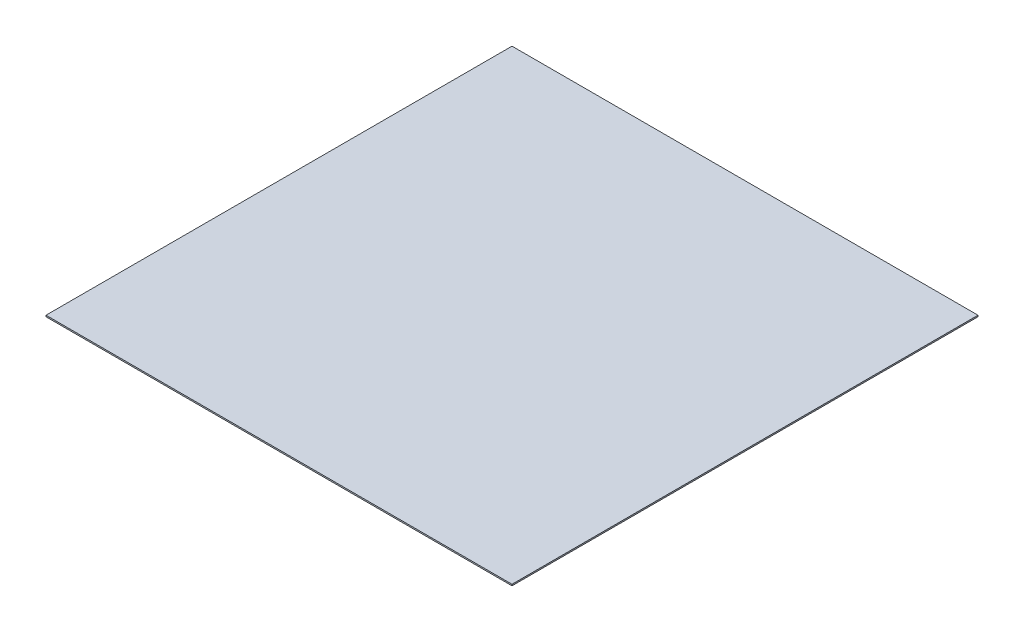
ISO-10303-21;
HEADER;
FILE_DESCRIPTION(('STEP AP214'),'2;1');
FILE_NAME('part.step','',(''),(''),'','','');
FILE_SCHEMA(('AUTOMOTIVE_DESIGN { 1 0 10303 214 1 1 1 1 }'));
ENDSEC;
DATA;
#1=APPLICATION_CONTEXT('core data for automotive mechanical design processes');
#2=APPLICATION_PROTOCOL_DEFINITION('international standard','automotive_design',2000,#1);
#3=PRODUCT_CONTEXT('',#1,'mechanical');
#4=PRODUCT('Part','Part','',(#3));
#5=PRODUCT_RELATED_PRODUCT_CATEGORY('part','',(#4));
#6=PRODUCT_DEFINITION_FORMATION('','',#4);
#7=PRODUCT_DEFINITION_CONTEXT('part definition',#1,'design');
#8=PRODUCT_DEFINITION('design','',#6,#7);
#9=PRODUCT_DEFINITION_SHAPE('','',#8);
#10=(LENGTH_UNIT() NAMED_UNIT(*) SI_UNIT(.MILLI.,.METRE.));
#11=(NAMED_UNIT(*) PLANE_ANGLE_UNIT() SI_UNIT($,.RADIAN.));
#12=(NAMED_UNIT(*) SI_UNIT($,.STERADIAN.) SOLID_ANGLE_UNIT());
#13=UNCERTAINTY_MEASURE_WITH_UNIT(LENGTH_MEASURE(1.E-05),#10,'distance_accuracy_value','');
#14=(GEOMETRIC_REPRESENTATION_CONTEXT(3) GLOBAL_UNCERTAINTY_ASSIGNED_CONTEXT((#13)) GLOBAL_UNIT_ASSIGNED_CONTEXT((#10,
#11,#12)) REPRESENTATION_CONTEXT('',''));
#15=CARTESIAN_POINT('',(0.,0.,0.));
#16=DIRECTION('',(0.,0.,1.));
#17=DIRECTION('',(1.,0.,0.));
#18=AXIS2_PLACEMENT_3D('',#15,#16,#17);
#19=CARTESIAN_POINT('',(0.,3.,0.));
#20=DIRECTION('',(1.,0.,0.));
#21=DIRECTION('',(0.,0.,-1.));
#22=AXIS2_PLACEMENT_3D('',#19,#20,#21);
#23=PLANE('',#22);
#24=DIRECTION('',(0.,0.,1.));
#25=VECTOR('',#24,1.);
#26=CARTESIAN_POINT('',(0.,0.,0.));
#27=LINE('',#26,#25);
#28=CARTESIAN_POINT('',(0.,0.,-1000.));
#29=VERTEX_POINT('',#28);
#30=CARTESIAN_POINT('',(0.,0.,0.));
#31=VERTEX_POINT('',#30);
#32=EDGE_CURVE('E96',#29,#31,#27,.T.);
#33=ORIENTED_EDGE('',*,*,#32,.T.);
#34=DIRECTION('',(0.,-1.,0.));
#35=VECTOR('',#34,1.);
#36=CARTESIAN_POINT('',(0.,3.,0.));
#37=LINE('',#36,#35);
#38=CARTESIAN_POINT('',(0.,3.,0.));
#39=VERTEX_POINT('',#38);
#40=EDGE_CURVE('E11',#39,#31,#37,.T.);
#41=ORIENTED_EDGE('',*,*,#40,.F.);
#42=DIRECTION('',(0.,0.,1.));
#43=VECTOR('',#42,1.);
#44=CARTESIAN_POINT('',(0.,3.,0.));
#45=LINE('',#44,#43);
#46=CARTESIAN_POINT('',(0.,3.,-1000.));
#47=VERTEX_POINT('',#46);
#48=EDGE_CURVE('E84',#47,#39,#45,.T.);
#49=ORIENTED_EDGE('',*,*,#48,.F.);
#50=DIRECTION('',(0.,-1.,0.));
#51=VECTOR('',#50,1.);
#52=CARTESIAN_POINT('',(0.,3.,-1000.));
#53=LINE('',#52,#51);
#54=EDGE_CURVE('E92',#47,#29,#53,.T.);
#55=ORIENTED_EDGE('',*,*,#54,.T.);
#56=EDGE_LOOP('',(#33,#41,#49,#55));
#57=FACE_BOUND('',#56,.T.);
#58=ADVANCED_FACE('F33',(#57),#23,.F.);
#59=CARTESIAN_POINT('',(0.,3.,0.));
#60=DIRECTION('',(0.,0.,-1.));
#61=DIRECTION('',(-1.,0.,0.));
#62=AXIS2_PLACEMENT_3D('',#59,#60,#61);
#63=PLANE('',#62);
#64=DIRECTION('',(1.,0.,0.));
#65=VECTOR('',#64,1.);
#66=CARTESIAN_POINT('',(0.,0.,0.));
#67=LINE('',#66,#65);
#68=CARTESIAN_POINT('',(1000.,0.,0.));
#69=VERTEX_POINT('',#68);
#70=EDGE_CURVE('E88',#31,#69,#67,.T.);
#71=ORIENTED_EDGE('',*,*,#70,.T.);
#72=DIRECTION('',(0.,-1.,0.));
#73=VECTOR('',#72,1.);
#74=CARTESIAN_POINT('',(1000.,3.,0.));
#75=LINE('',#74,#73);
#76=CARTESIAN_POINT('',(1000.,3.,0.));
#77=VERTEX_POINT('',#76);
#78=EDGE_CURVE('E41',#77,#69,#75,.T.);
#79=ORIENTED_EDGE('',*,*,#78,.F.);
#80=DIRECTION('',(1.,0.,0.));
#81=VECTOR('',#80,1.);
#82=CARTESIAN_POINT('',(0.,3.,0.));
#83=LINE('',#82,#81);
#84=EDGE_CURVE('E79',#39,#77,#83,.T.);
#85=ORIENTED_EDGE('',*,*,#84,.F.);
#86=ORIENTED_EDGE('',*,*,#40,.T.);
#87=EDGE_LOOP('',(#71,#79,#85,#86));
#88=FACE_BOUND('',#87,.T.);
#89=ADVANCED_FACE('F87',(#88),#63,.F.);
#90=CARTESIAN_POINT('',(1000.,3.,0.));
#91=DIRECTION('',(-1.,0.,0.));
#92=DIRECTION('',(0.,0.,1.));
#93=AXIS2_PLACEMENT_3D('',#90,#91,#92);
#94=PLANE('',#93);
#95=DIRECTION('',(0.,0.,-1.));
#96=VECTOR('',#95,1.);
#97=CARTESIAN_POINT('',(1000.,0.,0.));
#98=LINE('',#97,#96);
#99=CARTESIAN_POINT('',(1000.,0.,-1000.));
#100=VERTEX_POINT('',#99);
#101=EDGE_CURVE('E66',#69,#100,#98,.T.);
#102=ORIENTED_EDGE('',*,*,#101,.T.);
#103=DIRECTION('',(0.,-1.,0.));
#104=VECTOR('',#103,1.);
#105=CARTESIAN_POINT('',(1000.,3.,-1000.));
#106=LINE('',#105,#104);
#107=CARTESIAN_POINT('',(1000.,3.,-1000.));
#108=VERTEX_POINT('',#107);
#109=EDGE_CURVE('E89',#108,#100,#106,.T.);
#110=ORIENTED_EDGE('',*,*,#109,.F.);
#111=DIRECTION('',(0.,0.,-1.));
#112=VECTOR('',#111,1.);
#113=CARTESIAN_POINT('',(1000.,3.,0.));
#114=LINE('',#113,#112);
#115=EDGE_CURVE('E82',#77,#108,#114,.T.);
#116=ORIENTED_EDGE('',*,*,#115,.F.);
#117=ORIENTED_EDGE('',*,*,#78,.T.);
#118=EDGE_LOOP('',(#102,#110,#116,#117));
#119=FACE_BOUND('',#118,.T.);
#120=ADVANCED_FACE('F90',(#119),#94,.F.);
#121=CARTESIAN_POINT('',(0.,3.,-1000.));
#122=DIRECTION('',(0.,0.,1.));
#123=DIRECTION('',(1.,0.,0.));
#124=AXIS2_PLACEMENT_3D('',#121,#122,#123);
#125=PLANE('',#124);
#126=DIRECTION('',(-1.,0.,0.));
#127=VECTOR('',#126,1.);
#128=CARTESIAN_POINT('',(0.,0.,-1000.));
#129=LINE('',#128,#127);
#130=EDGE_CURVE('E72',#100,#29,#129,.T.);
#131=ORIENTED_EDGE('',*,*,#130,.T.);
#132=ORIENTED_EDGE('',*,*,#54,.F.);
#133=DIRECTION('',(-1.,0.,0.));
#134=VECTOR('',#133,1.);
#135=CARTESIAN_POINT('',(0.,3.,-1000.));
#136=LINE('',#135,#134);
#137=EDGE_CURVE('E49',#108,#47,#136,.T.);
#138=ORIENTED_EDGE('',*,*,#137,.F.);
#139=ORIENTED_EDGE('',*,*,#109,.T.);
#140=EDGE_LOOP('',(#131,#132,#138,#139));
#141=FACE_BOUND('',#140,.T.);
#142=ADVANCED_FACE('F103',(#141),#125,.F.);
#143=CARTESIAN_POINT('',(0.,3.,0.));
#144=DIRECTION('',(0.,-1.,0.));
#145=DIRECTION('',(0.,0.,-1.));
#146=AXIS2_PLACEMENT_3D('',#143,#144,#145);
#147=PLANE('',#146);
#148=ORIENTED_EDGE('',*,*,#48,.T.);
#149=ORIENTED_EDGE('',*,*,#84,.T.);
#150=ORIENTED_EDGE('',*,*,#115,.T.);
#151=ORIENTED_EDGE('',*,*,#137,.T.);
#152=EDGE_LOOP('',(#148,#149,#150,#151));
#153=FACE_BOUND('',#152,.T.);
#154=ADVANCED_FACE('F80',(#153),#147,.F.);
#155=CARTESIAN_POINT('',(0.,0.,0.));
#156=DIRECTION('',(0.,-1.,0.));
#157=DIRECTION('',(0.,0.,-1.));
#158=AXIS2_PLACEMENT_3D('',#155,#156,#157);
#159=PLANE('',#158);
#160=ORIENTED_EDGE('',*,*,#32,.F.);
#161=ORIENTED_EDGE('',*,*,#130,.F.);
#162=ORIENTED_EDGE('',*,*,#101,.F.);
#163=ORIENTED_EDGE('',*,*,#70,.F.);
#164=EDGE_LOOP('',(#160,#161,#162,#163));
#165=FACE_BOUND('',#164,.T.);
#166=ADVANCED_FACE('F106',(#165),#159,.T.);
#167=CLOSED_SHELL('',(#58,#89,#120,#142,#154,#166));
#168=MANIFOLD_SOLID_BREP('B2',#167);
#169=ADVANCED_BREP_SHAPE_REPRESENTATION('',(#18,#168),#14);
#170=SHAPE_DEFINITION_REPRESENTATION(#9,#169);
ENDSEC;
END-ISO-10303-21;
